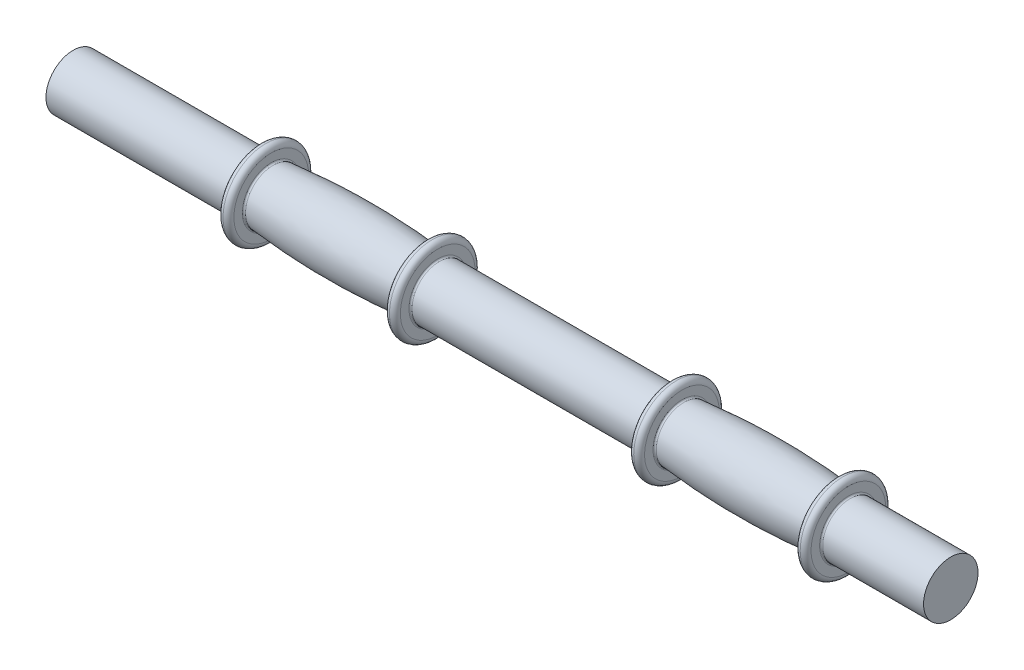
ISO-10303-21;
HEADER;
FILE_DESCRIPTION(('STEP AP214'),'2;1');
FILE_NAME('part.step','',(''),(''),'','','');
FILE_SCHEMA(('AUTOMOTIVE_DESIGN { 1 0 10303 214 1 1 1 1 }'));
ENDSEC;
DATA;
#1=APPLICATION_CONTEXT('core data for automotive mechanical design processes');
#2=APPLICATION_PROTOCOL_DEFINITION('international standard','automotive_design',2000,#1);
#3=PRODUCT_CONTEXT('',#1,'mechanical');
#4=PRODUCT('Part','Part','',(#3));
#5=PRODUCT_RELATED_PRODUCT_CATEGORY('part','',(#4));
#6=PRODUCT_DEFINITION_FORMATION('','',#4);
#7=PRODUCT_DEFINITION_CONTEXT('part definition',#1,'design');
#8=PRODUCT_DEFINITION('design','',#6,#7);
#9=PRODUCT_DEFINITION_SHAPE('','',#8);
#10=(LENGTH_UNIT() NAMED_UNIT(*) SI_UNIT(.MILLI.,.METRE.));
#11=(NAMED_UNIT(*) PLANE_ANGLE_UNIT() SI_UNIT($,.RADIAN.));
#12=(NAMED_UNIT(*) SI_UNIT($,.STERADIAN.) SOLID_ANGLE_UNIT());
#13=UNCERTAINTY_MEASURE_WITH_UNIT(LENGTH_MEASURE(1.E-05),#10,'distance_accuracy_value','');
#14=(GEOMETRIC_REPRESENTATION_CONTEXT(3) GLOBAL_UNCERTAINTY_ASSIGNED_CONTEXT((#13)) GLOBAL_UNIT_ASSIGNED_CONTEXT((#10,
#11,#12)) REPRESENTATION_CONTEXT('',''));
#15=CARTESIAN_POINT('',(0.,0.,0.));
#16=DIRECTION('',(0.,0.,1.));
#17=DIRECTION('',(1.,0.,0.));
#18=AXIS2_PLACEMENT_3D('',#15,#16,#17);
#19=CARTESIAN_POINT('',(564.12,17.5,0.));
#20=DIRECTION('',(1.,0.,0.));
#21=DIRECTION('',(0.,0.,-1.));
#22=AXIS2_PLACEMENT_3D('',#19,#20,#21);
#23=PLANE('',#22);
#24=CARTESIAN_POINT('',(564.12,0.,0.));
#25=DIRECTION('',(1.,0.,0.));
#26=DIRECTION('',(0.,0.,-1.));
#27=AXIS2_PLACEMENT_3D('',#24,#25,#26);
#28=CIRCLE('',#27,17.5);
#29=CARTESIAN_POINT('',(564.12,0.,-17.5));
#30=VERTEX_POINT('',#29);
#31=EDGE_CURVE('E163',#30,#30,#28,.T.);
#32=ORIENTED_EDGE('',*,*,#31,.T.);
#33=EDGE_LOOP('',(#32));
#34=FACE_BOUND('',#33,.T.);
#35=ADVANCED_FACE('F41',(#34),#23,.T.);
#36=CARTESIAN_POINT('',(564.12,0.,0.));
#37=DIRECTION('',(1.,0.,0.));
#38=DIRECTION('',(0.,0.,-1.));
#39=AXIS2_PLACEMENT_3D('',#36,#37,#38);
#40=CYLINDRICAL_SURFACE('',#39,17.5);
#41=CARTESIAN_POINT('',(499.32,0.,0.));
#42=DIRECTION('',(1.,0.,0.));
#43=DIRECTION('',(0.,0.,-1.));
#44=AXIS2_PLACEMENT_3D('',#41,#42,#43);
#45=CIRCLE('',#44,17.5);
#46=CARTESIAN_POINT('',(499.32,0.,-17.5));
#47=VERTEX_POINT('',#46);
#48=EDGE_CURVE('E97',#47,#47,#45,.T.);
#49=ORIENTED_EDGE('',*,*,#48,.T.);
#50=EDGE_LOOP('',(#49));
#51=FACE_BOUND('',#50,.T.);
#52=ORIENTED_EDGE('',*,*,#31,.F.);
#53=EDGE_LOOP('',(#52));
#54=FACE_BOUND('',#53,.T.);
#55=ADVANCED_FACE('F220',(#51,#54),#40,.T.);
#56=CARTESIAN_POINT('',(498.32,27.5,0.));
#57=DIRECTION('',(1.,0.,0.));
#58=DIRECTION('',(0.,0.,-1.));
#59=AXIS2_PLACEMENT_3D('',#56,#57,#58);
#60=PLANE('',#59);
#61=CARTESIAN_POINT('',(498.32,0.,0.));
#62=DIRECTION('',(1.,0.,0.));
#63=DIRECTION('',(0.,0.,-1.));
#64=AXIS2_PLACEMENT_3D('',#61,#62,#63);
#65=CIRCLE('',#64,18.5);
#66=CARTESIAN_POINT('',(498.32,0.,-18.5));
#67=VERTEX_POINT('',#66);
#68=EDGE_CURVE('E93',#67,#67,#65,.F.);
#69=ORIENTED_EDGE('',*,*,#68,.T.);
#70=EDGE_LOOP('',(#69));
#71=FACE_BOUND('',#70,.T.);
#72=CARTESIAN_POINT('',(498.32,0.,0.));
#73=DIRECTION('',(1.,0.,0.));
#74=DIRECTION('',(0.,0.,-1.));
#75=AXIS2_PLACEMENT_3D('',#72,#73,#74);
#76=CIRCLE('',#75,24.);
#77=CARTESIAN_POINT('',(498.32,0.,-24.));
#78=VERTEX_POINT('',#77);
#79=EDGE_CURVE('E159',#78,#78,#76,.T.);
#80=ORIENTED_EDGE('',*,*,#79,.T.);
#81=EDGE_LOOP('',(#80));
#82=FACE_BOUND('',#81,.T.);
#83=ADVANCED_FACE('F216',(#71,#82),#60,.T.);
#84=CARTESIAN_POINT('',(491.32,17.5000000000001,0.));
#85=DIRECTION('',(-1.,0.,0.));
#86=DIRECTION('',(0.,0.,1.));
#87=AXIS2_PLACEMENT_3D('',#84,#85,#86);
#88=PLANE('',#87);
#89=CARTESIAN_POINT('',(491.32,0.,0.));
#90=DIRECTION('',(-1.,0.,0.));
#91=DIRECTION('',(0.,0.,1.));
#92=AXIS2_PLACEMENT_3D('',#89,#90,#91);
#93=CIRCLE('',#92,18.6037810315104);
#94=CARTESIAN_POINT('',(491.32,0.,18.6037810315104));
#95=VERTEX_POINT('',#94);
#96=EDGE_CURVE('E109',#95,#95,#93,.F.);
#97=ORIENTED_EDGE('',*,*,#96,.T.);
#98=EDGE_LOOP('',(#97));
#99=FACE_BOUND('',#98,.T.);
#100=CARTESIAN_POINT('',(491.32,0.,0.));
#101=DIRECTION('',(-1.,0.,0.));
#102=DIRECTION('',(0.,0.,1.));
#103=AXIS2_PLACEMENT_3D('',#100,#101,#102);
#104=CIRCLE('',#103,24.);
#105=CARTESIAN_POINT('',(491.32,0.,24.));
#106=VERTEX_POINT('',#105);
#107=EDGE_CURVE('E155',#106,#106,#104,.T.);
#108=ORIENTED_EDGE('',*,*,#107,.T.);
#109=EDGE_LOOP('',(#108));
#110=FACE_BOUND('',#109,.T.);
#111=ADVANCED_FACE('F212',(#99,#110),#88,.T.);
#112=CARTESIAN_POINT('',(491.32,17.5000000000001,0.));
#113=CARTESIAN_POINT('',(441.32,22.4999999999999,0.));
#114=CARTESIAN_POINT('',(391.32,17.5,0.));
#115=B_SPLINE_CURVE_WITH_KNOTS('',2,(#112,#113,#114),.UNSPECIFIED.,.F.,.F.,(3,3),(0.,1.),.UNSPECIFIED.);
#116=CARTESIAN_POINT('',(564.12,0.,0.));
#117=DIRECTION('',(1.,0.,0.));
#118=AXIS1_PLACEMENT('',#116,#117);
#119=SURFACE_OF_REVOLUTION('',#115,#118);
#120=CARTESIAN_POINT('',(490.22265914905,0.,0.));
#121=DIRECTION('',(1.,0.,0.));
#122=DIRECTION('',(0.,0.,-1.));
#123=AXIS2_PLACEMENT_3D('',#120,#121,#122);
#124=CIRCLE('',#123,17.6085299281519);
#125=CARTESIAN_POINT('',(490.22265914905,0.,-17.6085299281519));
#126=VERTEX_POINT('',#125);
#127=EDGE_CURVE('E101',#126,#126,#124,.F.);
#128=ORIENTED_EDGE('',*,*,#127,.T.);
#129=EDGE_LOOP('',(#128));
#130=FACE_BOUND('',#129,.T.);
#131=CARTESIAN_POINT('',(392.41734085095,0.,0.));
#132=DIRECTION('',(1.,0.,0.));
#133=DIRECTION('',(0.,0.,-1.));
#134=AXIS2_PLACEMENT_3D('',#131,#132,#133);
#135=CIRCLE('',#134,17.6085299281519);
#136=CARTESIAN_POINT('',(392.41734085095,0.,-17.6085299281519));
#137=VERTEX_POINT('',#136);
#138=EDGE_CURVE('E105',#137,#137,#135,.T.);
#139=ORIENTED_EDGE('',*,*,#138,.T.);
#140=EDGE_LOOP('',(#139));
#141=FACE_BOUND('',#140,.T.);
#142=ADVANCED_FACE('F208',(#130,#141),#119,.F.);
#143=CARTESIAN_POINT('',(391.32,27.5,0.));
#144=DIRECTION('',(1.,0.,0.));
#145=DIRECTION('',(0.,0.,-1.));
#146=AXIS2_PLACEMENT_3D('',#143,#144,#145);
#147=PLANE('',#146);
#148=CARTESIAN_POINT('',(391.32,0.,0.));
#149=DIRECTION('',(1.,0.,0.));
#150=DIRECTION('',(0.,0.,-1.));
#151=AXIS2_PLACEMENT_3D('',#148,#149,#150);
#152=CIRCLE('',#151,18.6037810315104);
#153=CARTESIAN_POINT('',(391.32,0.,-18.6037810315104));
#154=VERTEX_POINT('',#153);
#155=EDGE_CURVE('E89',#154,#154,#152,.F.);
#156=ORIENTED_EDGE('',*,*,#155,.T.);
#157=EDGE_LOOP('',(#156));
#158=FACE_BOUND('',#157,.T.);
#159=CARTESIAN_POINT('',(391.32,0.,0.));
#160=DIRECTION('',(1.,0.,0.));
#161=DIRECTION('',(0.,0.,-1.));
#162=AXIS2_PLACEMENT_3D('',#159,#160,#161);
#163=CIRCLE('',#162,24.);
#164=CARTESIAN_POINT('',(391.32,0.,-24.));
#165=VERTEX_POINT('',#164);
#166=EDGE_CURVE('E151',#165,#165,#163,.T.);
#167=ORIENTED_EDGE('',*,*,#166,.T.);
#168=EDGE_LOOP('',(#167));
#169=FACE_BOUND('',#168,.T.);
#170=ADVANCED_FACE('F204',(#158,#169),#147,.T.);
#171=CARTESIAN_POINT('',(384.32,17.5,0.));
#172=DIRECTION('',(-1.,0.,0.));
#173=DIRECTION('',(0.,0.,1.));
#174=AXIS2_PLACEMENT_3D('',#171,#172,#173);
#175=PLANE('',#174);
#176=CARTESIAN_POINT('',(384.32,0.,0.));
#177=DIRECTION('',(-1.,0.,0.));
#178=DIRECTION('',(0.,0.,1.));
#179=AXIS2_PLACEMENT_3D('',#176,#177,#178);
#180=CIRCLE('',#179,18.5);
#181=CARTESIAN_POINT('',(384.32,0.,18.5));
#182=VERTEX_POINT('',#181);
#183=EDGE_CURVE('E85',#182,#182,#180,.F.);
#184=ORIENTED_EDGE('',*,*,#183,.T.);
#185=EDGE_LOOP('',(#184));
#186=FACE_BOUND('',#185,.T.);
#187=CARTESIAN_POINT('',(384.32,0.,0.));
#188=DIRECTION('',(-1.,0.,0.));
#189=DIRECTION('',(0.,0.,1.));
#190=AXIS2_PLACEMENT_3D('',#187,#188,#189);
#191=CIRCLE('',#190,24.);
#192=CARTESIAN_POINT('',(384.32,0.,24.));
#193=VERTEX_POINT('',#192);
#194=EDGE_CURVE('E147',#193,#193,#191,.T.);
#195=ORIENTED_EDGE('',*,*,#194,.T.);
#196=EDGE_LOOP('',(#195));
#197=FACE_BOUND('',#196,.T.);
#198=ADVANCED_FACE('F200',(#186,#197),#175,.T.);
#199=CARTESIAN_POINT('',(564.12,0.,0.));
#200=DIRECTION('',(1.,0.,0.));
#201=DIRECTION('',(0.,0.,-1.));
#202=AXIS2_PLACEMENT_3D('',#199,#200,#201);
#203=CYLINDRICAL_SURFACE('',#202,17.5);
#204=CARTESIAN_POINT('',(383.32,0.,0.));
#205=DIRECTION('',(-1.,0.,0.));
#206=DIRECTION('',(0.,0.,1.));
#207=AXIS2_PLACEMENT_3D('',#204,#205,#206);
#208=CIRCLE('',#207,17.5);
#209=CARTESIAN_POINT('',(383.32,0.,17.5));
#210=VERTEX_POINT('',#209);
#211=EDGE_CURVE('E77',#210,#210,#208,.T.);
#212=ORIENTED_EDGE('',*,*,#211,.T.);
#213=EDGE_LOOP('',(#212));
#214=FACE_BOUND('',#213,.T.);
#215=CARTESIAN_POINT('',(235.32,0.,0.));
#216=DIRECTION('',(1.,0.,0.));
#217=DIRECTION('',(0.,0.,-1.));
#218=AXIS2_PLACEMENT_3D('',#215,#216,#217);
#219=CIRCLE('',#218,17.5);
#220=CARTESIAN_POINT('',(235.32,0.,-17.5));
#221=VERTEX_POINT('',#220);
#222=EDGE_CURVE('E81',#221,#221,#219,.T.);
#223=ORIENTED_EDGE('',*,*,#222,.T.);
#224=EDGE_LOOP('',(#223));
#225=FACE_BOUND('',#224,.T.);
#226=ADVANCED_FACE('F196',(#214,#225),#203,.T.);
#227=CARTESIAN_POINT('',(234.32,27.5,0.));
#228=DIRECTION('',(1.,0.,0.));
#229=DIRECTION('',(0.,0.,-1.));
#230=AXIS2_PLACEMENT_3D('',#227,#228,#229);
#231=PLANE('',#230);
#232=CARTESIAN_POINT('',(234.32,0.,0.));
#233=DIRECTION('',(1.,0.,0.));
#234=DIRECTION('',(0.,0.,-1.));
#235=AXIS2_PLACEMENT_3D('',#232,#233,#234);
#236=CIRCLE('',#235,18.5);
#237=CARTESIAN_POINT('',(234.32,0.,-18.5));
#238=VERTEX_POINT('',#237);
#239=EDGE_CURVE('E73',#238,#238,#236,.F.);
#240=ORIENTED_EDGE('',*,*,#239,.T.);
#241=EDGE_LOOP('',(#240));
#242=FACE_BOUND('',#241,.T.);
#243=CARTESIAN_POINT('',(234.32,0.,0.));
#244=DIRECTION('',(1.,0.,0.));
#245=DIRECTION('',(0.,0.,-1.));
#246=AXIS2_PLACEMENT_3D('',#243,#244,#245);
#247=CIRCLE('',#246,24.);
#248=CARTESIAN_POINT('',(234.32,0.,-24.));
#249=VERTEX_POINT('',#248);
#250=EDGE_CURVE('E143',#249,#249,#247,.T.);
#251=ORIENTED_EDGE('',*,*,#250,.T.);
#252=EDGE_LOOP('',(#251));
#253=FACE_BOUND('',#252,.T.);
#254=ADVANCED_FACE('F192',(#242,#253),#231,.T.);
#255=CARTESIAN_POINT('',(227.32,17.5,0.));
#256=DIRECTION('',(-1.,0.,0.));
#257=DIRECTION('',(0.,0.,1.));
#258=AXIS2_PLACEMENT_3D('',#255,#256,#257);
#259=PLANE('',#258);
#260=CARTESIAN_POINT('',(227.32,0.,0.));
#261=DIRECTION('',(-1.,0.,0.));
#262=DIRECTION('',(0.,0.,1.));
#263=AXIS2_PLACEMENT_3D('',#260,#261,#262);
#264=CIRCLE('',#263,18.6037810315104);
#265=CARTESIAN_POINT('',(227.32,0.,18.6037810315104));
#266=VERTEX_POINT('',#265);
#267=EDGE_CURVE('E69',#266,#266,#264,.F.);
#268=ORIENTED_EDGE('',*,*,#267,.T.);
#269=EDGE_LOOP('',(#268));
#270=FACE_BOUND('',#269,.T.);
#271=CARTESIAN_POINT('',(227.32,0.,0.));
#272=DIRECTION('',(-1.,0.,0.));
#273=DIRECTION('',(0.,0.,1.));
#274=AXIS2_PLACEMENT_3D('',#271,#272,#273);
#275=CIRCLE('',#274,24.);
#276=CARTESIAN_POINT('',(227.32,0.,24.));
#277=VERTEX_POINT('',#276);
#278=EDGE_CURVE('E139',#277,#277,#275,.T.);
#279=ORIENTED_EDGE('',*,*,#278,.T.);
#280=EDGE_LOOP('',(#279));
#281=FACE_BOUND('',#280,.T.);
#282=ADVANCED_FACE('F187',(#270,#281),#259,.T.);
#283=CARTESIAN_POINT('',(227.32,17.5,0.));
#284=CARTESIAN_POINT('',(177.32,22.4999999999999,0.));
#285=CARTESIAN_POINT('',(127.32,17.5,0.));
#286=B_SPLINE_CURVE_WITH_KNOTS('',2,(#283,#284,#285),.UNSPECIFIED.,.F.,.F.,(3,3),(0.,1.),.UNSPECIFIED.);
#287=CARTESIAN_POINT('',(564.12,0.,0.));
#288=DIRECTION('',(1.,0.,0.));
#289=AXIS1_PLACEMENT('',#287,#288);
#290=SURFACE_OF_REVOLUTION('',#286,#289);
#291=CARTESIAN_POINT('',(226.22265914905,0.,0.));
#292=DIRECTION('',(1.,0.,0.));
#293=DIRECTION('',(0.,0.,-1.));
#294=AXIS2_PLACEMENT_3D('',#291,#292,#293);
#295=CIRCLE('',#294,17.6085299281519);
#296=CARTESIAN_POINT('',(226.22265914905,0.,-17.6085299281519));
#297=VERTEX_POINT('',#296);
#298=EDGE_CURVE('E59',#297,#297,#295,.F.);
#299=ORIENTED_EDGE('',*,*,#298,.T.);
#300=EDGE_LOOP('',(#299));
#301=FACE_BOUND('',#300,.T.);
#302=CARTESIAN_POINT('',(128.417340850951,0.,0.));
#303=DIRECTION('',(1.,0.,0.));
#304=DIRECTION('',(0.,0.,-1.));
#305=AXIS2_PLACEMENT_3D('',#302,#303,#304);
#306=CIRCLE('',#305,17.6085299281519);
#307=CARTESIAN_POINT('',(128.417340850951,0.,-17.6085299281519));
#308=VERTEX_POINT('',#307);
#309=EDGE_CURVE('E65',#308,#308,#306,.T.);
#310=ORIENTED_EDGE('',*,*,#309,.T.);
#311=EDGE_LOOP('',(#310));
#312=FACE_BOUND('',#311,.T.);
#313=ADVANCED_FACE('F182',(#301,#312),#290,.F.);
#314=CARTESIAN_POINT('',(127.32,27.5,0.));
#315=DIRECTION('',(1.,0.,0.));
#316=DIRECTION('',(0.,0.,-1.));
#317=AXIS2_PLACEMENT_3D('',#314,#315,#316);
#318=PLANE('',#317);
#319=CARTESIAN_POINT('',(127.32,0.,0.));
#320=DIRECTION('',(1.,0.,0.));
#321=DIRECTION('',(0.,0.,-1.));
#322=AXIS2_PLACEMENT_3D('',#319,#320,#321);
#323=CIRCLE('',#322,18.6037810315103);
#324=CARTESIAN_POINT('',(127.32,0.,-18.6037810315103));
#325=VERTEX_POINT('',#324);
#326=EDGE_CURVE('E54',#325,#325,#323,.F.);
#327=ORIENTED_EDGE('',*,*,#326,.T.);
#328=EDGE_LOOP('',(#327));
#329=FACE_BOUND('',#328,.T.);
#330=CARTESIAN_POINT('',(127.32,0.,0.));
#331=DIRECTION('',(1.,0.,0.));
#332=DIRECTION('',(0.,0.,-1.));
#333=AXIS2_PLACEMENT_3D('',#330,#331,#332);
#334=CIRCLE('',#333,24.);
#335=CARTESIAN_POINT('',(127.32,0.,-24.));
#336=VERTEX_POINT('',#335);
#337=EDGE_CURVE('E135',#336,#336,#334,.T.);
#338=ORIENTED_EDGE('',*,*,#337,.T.);
#339=EDGE_LOOP('',(#338));
#340=FACE_BOUND('',#339,.T.);
#341=ADVANCED_FACE('F186',(#329,#340),#318,.T.);
#342=CARTESIAN_POINT('',(120.32,17.5,0.));
#343=DIRECTION('',(-1.,0.,0.));
#344=DIRECTION('',(0.,0.,1.));
#345=AXIS2_PLACEMENT_3D('',#342,#343,#344);
#346=PLANE('',#345);
#347=CARTESIAN_POINT('',(120.32,0.,0.));
#348=DIRECTION('',(-1.,0.,0.));
#349=DIRECTION('',(0.,0.,1.));
#350=AXIS2_PLACEMENT_3D('',#347,#348,#349);
#351=CIRCLE('',#350,18.5);
#352=CARTESIAN_POINT('',(120.32,0.,18.5));
#353=VERTEX_POINT('',#352);
#354=EDGE_CURVE('E49',#353,#353,#351,.F.);
#355=ORIENTED_EDGE('',*,*,#354,.T.);
#356=EDGE_LOOP('',(#355));
#357=FACE_BOUND('',#356,.T.);
#358=CARTESIAN_POINT('',(120.32,0.,0.));
#359=DIRECTION('',(-1.,0.,0.));
#360=DIRECTION('',(0.,0.,1.));
#361=AXIS2_PLACEMENT_3D('',#358,#359,#360);
#362=CIRCLE('',#361,24.);
#363=CARTESIAN_POINT('',(120.32,0.,24.));
#364=VERTEX_POINT('',#363);
#365=EDGE_CURVE('E113',#364,#364,#362,.T.);
#366=ORIENTED_EDGE('',*,*,#365,.T.);
#367=EDGE_LOOP('',(#366));
#368=FACE_BOUND('',#367,.T.);
#369=ADVANCED_FACE('F299',(#357,#368),#346,.T.);
#370=CARTESIAN_POINT('',(564.12,0.,0.));
#371=DIRECTION('',(1.,0.,0.));
#372=DIRECTION('',(0.,0.,-1.));
#373=AXIS2_PLACEMENT_3D('',#370,#371,#372);
#374=CYLINDRICAL_SURFACE('',#373,17.5);
#375=CARTESIAN_POINT('',(119.32,0.,0.));
#376=DIRECTION('',(-1.,0.,0.));
#377=DIRECTION('',(0.,0.,1.));
#378=AXIS2_PLACEMENT_3D('',#375,#376,#377);
#379=CIRCLE('',#378,17.5);
#380=CARTESIAN_POINT('',(119.32,0.,17.5));
#381=VERTEX_POINT('',#380);
#382=EDGE_CURVE('E11',#381,#381,#379,.T.);
#383=ORIENTED_EDGE('',*,*,#382,.T.);
#384=EDGE_LOOP('',(#383));
#385=FACE_BOUND('',#384,.T.);
#386=CARTESIAN_POINT('',(0.,0.,0.));
#387=DIRECTION('',(1.,0.,0.));
#388=DIRECTION('',(0.,0.,-1.));
#389=AXIS2_PLACEMENT_3D('',#386,#387,#388);
#390=CIRCLE('',#389,17.5);
#391=CARTESIAN_POINT('',(0.,0.,-17.5));
#392=VERTEX_POINT('',#391);
#393=EDGE_CURVE('E131',#392,#392,#390,.T.);
#394=ORIENTED_EDGE('',*,*,#393,.T.);
#395=EDGE_LOOP('',(#394));
#396=FACE_BOUND('',#395,.T.);
#397=ADVANCED_FACE('F305',(#385,#396),#374,.T.);
#398=CARTESIAN_POINT('',(0.,0.,0.));
#399=DIRECTION('',(-1.,0.,0.));
#400=DIRECTION('',(0.,0.,1.));
#401=AXIS2_PLACEMENT_3D('',#398,#399,#400);
#402=PLANE('',#401);
#403=CARTESIAN_POINT('',(0.,0.,0.));
#404=DIRECTION('',(-1.,0.,0.));
#405=DIRECTION('',(0.,0.,1.));
#406=AXIS2_PLACEMENT_3D('',#403,#404,#405);
#407=CIRCLE('',#406,12.5);
#408=CARTESIAN_POINT('',(0.,0.,12.5));
#409=VERTEX_POINT('',#408);
#410=EDGE_CURVE('E326',#409,#409,#407,.T.);
#411=ORIENTED_EDGE('',*,*,#410,.F.);
#412=EDGE_LOOP('',(#411));
#413=FACE_BOUND('',#412,.T.);
#414=ORIENTED_EDGE('',*,*,#393,.F.);
#415=EDGE_LOOP('',(#414));
#416=FACE_BOUND('',#415,.T.);
#417=ADVANCED_FACE('F236',(#413,#416),#402,.T.);
#418=CARTESIAN_POINT('',(494.82,0.,0.));
#419=DIRECTION('',(-1.,0.,0.));
#420=DIRECTION('',(0.,0.,1.));
#421=AXIS2_PLACEMENT_3D('',#418,#419,#420);
#422=TOROIDAL_SURFACE('',#421,24.,3.5);
#423=ORIENTED_EDGE('',*,*,#107,.F.);
#424=EDGE_LOOP('',(#423));
#425=FACE_BOUND('',#424,.T.);
#426=CARTESIAN_POINT('',(494.82,0.,0.));
#427=DIRECTION('',(-1.,0.,0.));
#428=DIRECTION('',(0.,0.,1.));
#429=AXIS2_PLACEMENT_3D('',#426,#427,#428);
#430=CIRCLE('',#429,27.5);
#431=CARTESIAN_POINT('',(494.82,0.,27.5));
#432=VERTEX_POINT('',#431);
#433=EDGE_CURVE('E127',#432,#432,#430,.F.);
#434=ORIENTED_EDGE('',*,*,#433,.F.);
#435=EDGE_LOOP('',(#434));
#436=FACE_BOUND('',#435,.T.);
#437=ADVANCED_FACE('F232',(#425,#436),#422,.T.);
#438=CARTESIAN_POINT('',(494.82,0.,0.));
#439=DIRECTION('',(1.,0.,0.));
#440=DIRECTION('',(0.,0.,-1.));
#441=AXIS2_PLACEMENT_3D('',#438,#439,#440);
#442=TOROIDAL_SURFACE('',#441,24.,3.5);
#443=ORIENTED_EDGE('',*,*,#433,.T.);
#444=EDGE_LOOP('',(#443));
#445=FACE_BOUND('',#444,.T.);
#446=ORIENTED_EDGE('',*,*,#79,.F.);
#447=EDGE_LOOP('',(#446));
#448=FACE_BOUND('',#447,.T.);
#449=ADVANCED_FACE('F228',(#445,#448),#442,.T.);
#450=CARTESIAN_POINT('',(387.82,0.,0.));
#451=DIRECTION('',(-1.,0.,0.));
#452=DIRECTION('',(0.,0.,1.));
#453=AXIS2_PLACEMENT_3D('',#450,#451,#452);
#454=TOROIDAL_SURFACE('',#453,24.,3.5);
#455=ORIENTED_EDGE('',*,*,#194,.F.);
#456=EDGE_LOOP('',(#455));
#457=FACE_BOUND('',#456,.T.);
#458=CARTESIAN_POINT('',(387.82,0.,0.));
#459=DIRECTION('',(-1.,0.,0.));
#460=DIRECTION('',(0.,0.,1.));
#461=AXIS2_PLACEMENT_3D('',#458,#459,#460);
#462=CIRCLE('',#461,27.5);
#463=CARTESIAN_POINT('',(387.82,0.,27.5));
#464=VERTEX_POINT('',#463);
#465=EDGE_CURVE('E123',#464,#464,#462,.F.);
#466=ORIENTED_EDGE('',*,*,#465,.F.);
#467=EDGE_LOOP('',(#466));
#468=FACE_BOUND('',#467,.T.);
#469=ADVANCED_FACE('F231',(#457,#468),#454,.T.);
#470=CARTESIAN_POINT('',(387.82,0.,0.));
#471=DIRECTION('',(1.,0.,0.));
#472=DIRECTION('',(0.,0.,-1.));
#473=AXIS2_PLACEMENT_3D('',#470,#471,#472);
#474=TOROIDAL_SURFACE('',#473,24.,3.5);
#475=ORIENTED_EDGE('',*,*,#465,.T.);
#476=EDGE_LOOP('',(#475));
#477=FACE_BOUND('',#476,.T.);
#478=ORIENTED_EDGE('',*,*,#166,.F.);
#479=EDGE_LOOP('',(#478));
#480=FACE_BOUND('',#479,.T.);
#481=ADVANCED_FACE('F238',(#477,#480),#474,.T.);
#482=CARTESIAN_POINT('',(230.82,0.,0.));
#483=DIRECTION('',(-1.,0.,0.));
#484=DIRECTION('',(0.,0.,1.));
#485=AXIS2_PLACEMENT_3D('',#482,#483,#484);
#486=TOROIDAL_SURFACE('',#485,24.,3.5);
#487=ORIENTED_EDGE('',*,*,#278,.F.);
#488=EDGE_LOOP('',(#487));
#489=FACE_BOUND('',#488,.T.);
#490=CARTESIAN_POINT('',(230.82,0.,0.));
#491=DIRECTION('',(-1.,0.,0.));
#492=DIRECTION('',(0.,0.,1.));
#493=AXIS2_PLACEMENT_3D('',#490,#491,#492);
#494=CIRCLE('',#493,27.5);
#495=CARTESIAN_POINT('',(230.82,0.,27.5));
#496=VERTEX_POINT('',#495);
#497=EDGE_CURVE('E118',#496,#496,#494,.F.);
#498=ORIENTED_EDGE('',*,*,#497,.F.);
#499=EDGE_LOOP('',(#498));
#500=FACE_BOUND('',#499,.T.);
#501=ADVANCED_FACE('F241',(#489,#500),#486,.T.);
#502=CARTESIAN_POINT('',(230.82,0.,0.));
#503=DIRECTION('',(1.,0.,0.));
#504=DIRECTION('',(0.,0.,-1.));
#505=AXIS2_PLACEMENT_3D('',#502,#503,#504);
#506=TOROIDAL_SURFACE('',#505,24.,3.5);
#507=ORIENTED_EDGE('',*,*,#497,.T.);
#508=EDGE_LOOP('',(#507));
#509=FACE_BOUND('',#508,.T.);
#510=ORIENTED_EDGE('',*,*,#250,.F.);
#511=EDGE_LOOP('',(#510));
#512=FACE_BOUND('',#511,.T.);
#513=ADVANCED_FACE('F246',(#509,#512),#506,.T.);
#514=CARTESIAN_POINT('',(123.82,0.,0.));
#515=DIRECTION('',(-1.,0.,0.));
#516=DIRECTION('',(0.,0.,1.));
#517=AXIS2_PLACEMENT_3D('',#514,#515,#516);
#518=TOROIDAL_SURFACE('',#517,24.,3.5);
#519=ORIENTED_EDGE('',*,*,#365,.F.);
#520=EDGE_LOOP('',(#519));
#521=FACE_BOUND('',#520,.T.);
#522=CARTESIAN_POINT('',(123.82,0.,0.));
#523=DIRECTION('',(-1.,0.,0.));
#524=DIRECTION('',(0.,0.,1.));
#525=AXIS2_PLACEMENT_3D('',#522,#523,#524);
#526=CIRCLE('',#525,27.5);
#527=CARTESIAN_POINT('',(123.82,0.,27.5));
#528=VERTEX_POINT('',#527);
#529=EDGE_CURVE('E114',#528,#528,#526,.F.);
#530=ORIENTED_EDGE('',*,*,#529,.F.);
#531=EDGE_LOOP('',(#530));
#532=FACE_BOUND('',#531,.T.);
#533=ADVANCED_FACE('F249',(#521,#532),#518,.T.);
#534=CARTESIAN_POINT('',(123.82,0.,0.));
#535=DIRECTION('',(1.,0.,0.));
#536=DIRECTION('',(0.,0.,-1.));
#537=AXIS2_PLACEMENT_3D('',#534,#535,#536);
#538=TOROIDAL_SURFACE('',#537,24.,3.5);
#539=ORIENTED_EDGE('',*,*,#529,.T.);
#540=EDGE_LOOP('',(#539));
#541=FACE_BOUND('',#540,.T.);
#542=ORIENTED_EDGE('',*,*,#337,.F.);
#543=EDGE_LOOP('',(#542));
#544=FACE_BOUND('',#543,.T.);
#545=ADVANCED_FACE('F254',(#541,#544),#538,.T.);
#546=CARTESIAN_POINT('',(490.32,0.,0.));
#547=DIRECTION('',(1.,0.,0.));
#548=DIRECTION('',(0.,0.,-1.));
#549=AXIS2_PLACEMENT_3D('',#546,#547,#548);
#550=TOROIDAL_SURFACE('',#549,18.6037810315104,1.);
#551=ORIENTED_EDGE('',*,*,#127,.F.);
#552=EDGE_LOOP('',(#551));
#553=FACE_BOUND('',#552,.T.);
#554=ORIENTED_EDGE('',*,*,#96,.F.);
#555=EDGE_LOOP('',(#554));
#556=FACE_BOUND('',#555,.T.);
#557=ADVANCED_FACE('F257',(#553,#556),#550,.F.);
#558=CARTESIAN_POINT('',(499.32,0.,0.));
#559=DIRECTION('',(1.,0.,0.));
#560=DIRECTION('',(0.,0.,-1.));
#561=AXIS2_PLACEMENT_3D('',#558,#559,#560);
#562=TOROIDAL_SURFACE('',#561,18.5,1.);
#563=ORIENTED_EDGE('',*,*,#68,.F.);
#564=EDGE_LOOP('',(#563));
#565=FACE_BOUND('',#564,.T.);
#566=ORIENTED_EDGE('',*,*,#48,.F.);
#567=EDGE_LOOP('',(#566));
#568=FACE_BOUND('',#567,.T.);
#569=ADVANCED_FACE('F264',(#565,#568),#562,.F.);
#570=CARTESIAN_POINT('',(392.32,0.,0.));
#571=DIRECTION('',(1.,0.,0.));
#572=DIRECTION('',(0.,0.,-1.));
#573=AXIS2_PLACEMENT_3D('',#570,#571,#572);
#574=TOROIDAL_SURFACE('',#573,18.6037810315104,1.);
#575=ORIENTED_EDGE('',*,*,#155,.F.);
#576=EDGE_LOOP('',(#575));
#577=FACE_BOUND('',#576,.T.);
#578=ORIENTED_EDGE('',*,*,#138,.F.);
#579=EDGE_LOOP('',(#578));
#580=FACE_BOUND('',#579,.T.);
#581=ADVANCED_FACE('F268',(#577,#580),#574,.F.);
#582=CARTESIAN_POINT('',(383.32,0.,0.));
#583=DIRECTION('',(-1.,0.,0.));
#584=DIRECTION('',(0.,0.,1.));
#585=AXIS2_PLACEMENT_3D('',#582,#583,#584);
#586=TOROIDAL_SURFACE('',#585,18.5,1.);
#587=ORIENTED_EDGE('',*,*,#211,.F.);
#588=EDGE_LOOP('',(#587));
#589=FACE_BOUND('',#588,.T.);
#590=ORIENTED_EDGE('',*,*,#183,.F.);
#591=EDGE_LOOP('',(#590));
#592=FACE_BOUND('',#591,.T.);
#593=ADVANCED_FACE('F272',(#589,#592),#586,.F.);
#594=CARTESIAN_POINT('',(235.32,0.,0.));
#595=DIRECTION('',(1.,0.,0.));
#596=DIRECTION('',(0.,0.,-1.));
#597=AXIS2_PLACEMENT_3D('',#594,#595,#596);
#598=TOROIDAL_SURFACE('',#597,18.5,1.);
#599=ORIENTED_EDGE('',*,*,#239,.F.);
#600=EDGE_LOOP('',(#599));
#601=FACE_BOUND('',#600,.T.);
#602=ORIENTED_EDGE('',*,*,#222,.F.);
#603=EDGE_LOOP('',(#602));
#604=FACE_BOUND('',#603,.T.);
#605=ADVANCED_FACE('F276',(#601,#604),#598,.F.);
#606=CARTESIAN_POINT('',(226.32,0.,0.));
#607=DIRECTION('',(1.,0.,0.));
#608=DIRECTION('',(0.,0.,-1.));
#609=AXIS2_PLACEMENT_3D('',#606,#607,#608);
#610=TOROIDAL_SURFACE('',#609,18.6037810315104,1.);
#611=ORIENTED_EDGE('',*,*,#298,.F.);
#612=EDGE_LOOP('',(#611));
#613=FACE_BOUND('',#612,.T.);
#614=ORIENTED_EDGE('',*,*,#267,.F.);
#615=EDGE_LOOP('',(#614));
#616=FACE_BOUND('',#615,.T.);
#617=ADVANCED_FACE('F280',(#613,#616),#610,.F.);
#618=CARTESIAN_POINT('',(128.32,0.,0.));
#619=DIRECTION('',(1.,0.,0.));
#620=DIRECTION('',(0.,0.,-1.));
#621=AXIS2_PLACEMENT_3D('',#618,#619,#620);
#622=TOROIDAL_SURFACE('',#621,18.6037810315103,1.);
#623=ORIENTED_EDGE('',*,*,#326,.F.);
#624=EDGE_LOOP('',(#623));
#625=FACE_BOUND('',#624,.T.);
#626=ORIENTED_EDGE('',*,*,#309,.F.);
#627=EDGE_LOOP('',(#626));
#628=FACE_BOUND('',#627,.T.);
#629=ADVANCED_FACE('F283',(#625,#628),#622,.F.);
#630=CARTESIAN_POINT('',(119.32,0.,0.));
#631=DIRECTION('',(-1.,0.,0.));
#632=DIRECTION('',(0.,0.,1.));
#633=AXIS2_PLACEMENT_3D('',#630,#631,#632);
#634=TOROIDAL_SURFACE('',#633,18.5,1.);
#635=ORIENTED_EDGE('',*,*,#382,.F.);
#636=EDGE_LOOP('',(#635));
#637=FACE_BOUND('',#636,.T.);
#638=ORIENTED_EDGE('',*,*,#354,.F.);
#639=EDGE_LOOP('',(#638));
#640=FACE_BOUND('',#639,.T.);
#641=ADVANCED_FACE('F43',(#637,#640),#634,.F.);
#642=CARTESIAN_POINT('',(559.12,17.5,0.));
#643=DIRECTION('',(1.,0.,0.));
#644=DIRECTION('',(0.,0.,-1.));
#645=AXIS2_PLACEMENT_3D('',#642,#643,#644);
#646=PLANE('',#645);
#647=CARTESIAN_POINT('',(559.12,0.,0.));
#648=DIRECTION('',(1.,0.,0.));
#649=DIRECTION('',(0.,0.,-1.));
#650=AXIS2_PLACEMENT_3D('',#647,#648,#649);
#651=CIRCLE('',#650,12.5);
#652=CARTESIAN_POINT('',(559.12,0.,-12.5));
#653=VERTEX_POINT('',#652);
#654=EDGE_CURVE('E119',#653,#653,#651,.F.);
#655=ORIENTED_EDGE('',*,*,#654,.T.);
#656=EDGE_LOOP('',(#655));
#657=FACE_BOUND('',#656,.T.);
#658=ADVANCED_FACE('F290',(#657),#646,.F.);
#659=CARTESIAN_POINT('',(599.475339059327,0.,0.));
#660=DIRECTION('',(-1.,0.,0.));
#661=DIRECTION('',(0.,0.,1.));
#662=AXIS2_PLACEMENT_3D('',#659,#660,#661);
#663=CYLINDRICAL_SURFACE('',#662,12.5);
#664=ORIENTED_EDGE('',*,*,#410,.T.);
#665=EDGE_LOOP('',(#664));
#666=FACE_BOUND('',#665,.T.);
#667=ORIENTED_EDGE('',*,*,#654,.F.);
#668=EDGE_LOOP('',(#667));
#669=FACE_BOUND('',#668,.T.);
#670=ADVANCED_FACE('F317',(#666,#669),#663,.F.);
#671=CLOSED_SHELL('',(#35,#55,#83,#111,#142,#170,#198,#226,#254,#282,#313,#341,#369,#397,#417,
#437,#449,#469,#481,#501,#513,#533,#545,#557,#569,#581,#593,#605,#617,#629,#641,#658,#670));
#672=MANIFOLD_SOLID_BREP('B2',#671);
#673=ADVANCED_BREP_SHAPE_REPRESENTATION('',(#18,#672),#14);
#674=SHAPE_DEFINITION_REPRESENTATION(#9,#673);
ENDSEC;
END-ISO-10303-21;
